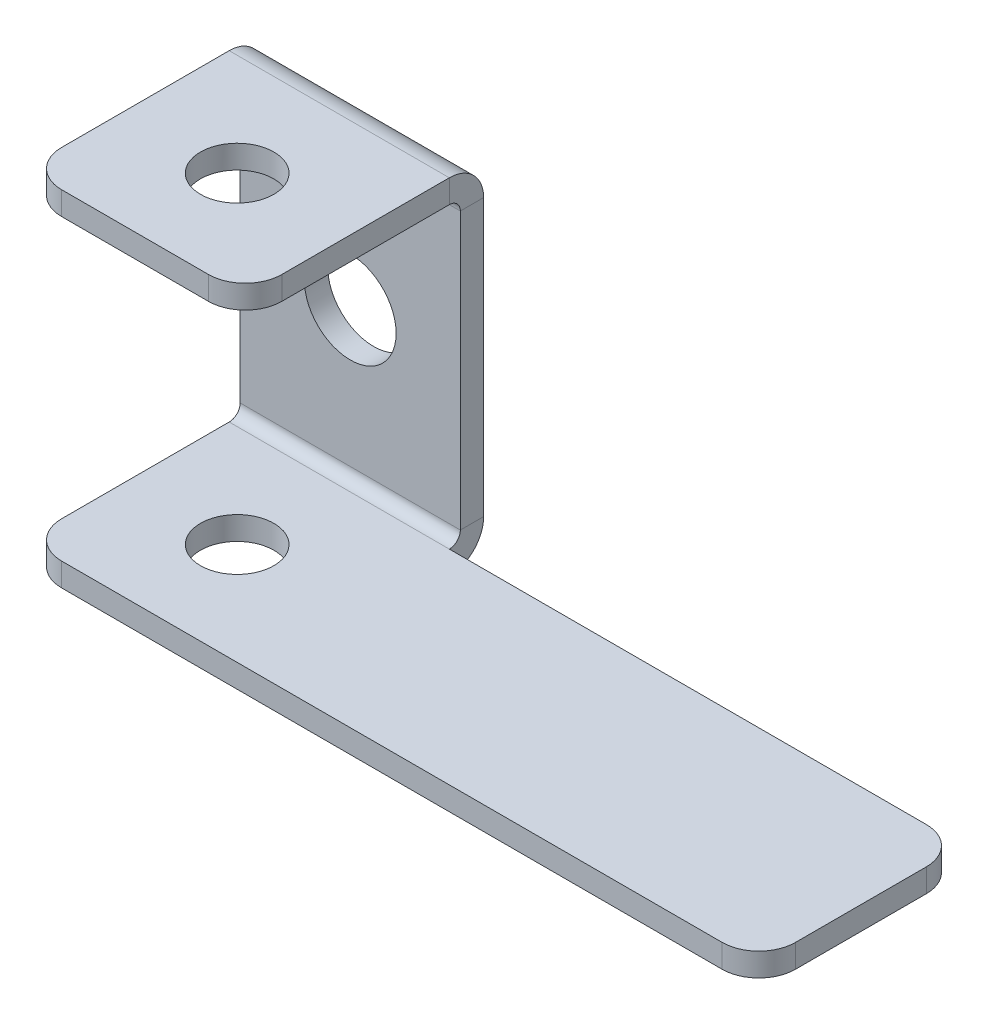
ISO-10303-21;
HEADER;
FILE_DESCRIPTION(('STEP AP214'),'2;1');
FILE_NAME('part.step','',(''),(''),'','','');
FILE_SCHEMA(('AUTOMOTIVE_DESIGN { 1 0 10303 214 1 1 1 1 }'));
ENDSEC;
DATA;
#1=APPLICATION_CONTEXT('core data for automotive mechanical design processes');
#2=APPLICATION_PROTOCOL_DEFINITION('international standard','automotive_design',2000,#1);
#3=PRODUCT_CONTEXT('',#1,'mechanical');
#4=PRODUCT('Part','Part','',(#3));
#5=PRODUCT_RELATED_PRODUCT_CATEGORY('part','',(#4));
#6=PRODUCT_DEFINITION_FORMATION('','',#4);
#7=PRODUCT_DEFINITION_CONTEXT('part definition',#1,'design');
#8=PRODUCT_DEFINITION('design','',#6,#7);
#9=PRODUCT_DEFINITION_SHAPE('','',#8);
#10=(LENGTH_UNIT() NAMED_UNIT(*) SI_UNIT(.MILLI.,.METRE.));
#11=(NAMED_UNIT(*) PLANE_ANGLE_UNIT() SI_UNIT($,.RADIAN.));
#12=(NAMED_UNIT(*) SI_UNIT($,.STERADIAN.) SOLID_ANGLE_UNIT());
#13=UNCERTAINTY_MEASURE_WITH_UNIT(LENGTH_MEASURE(1.E-05),#10,'distance_accuracy_value','');
#14=(GEOMETRIC_REPRESENTATION_CONTEXT(3) GLOBAL_UNCERTAINTY_ASSIGNED_CONTEXT((#13)) GLOBAL_UNIT_ASSIGNED_CONTEXT((#10,
#11,#12)) REPRESENTATION_CONTEXT('',''));
#15=CARTESIAN_POINT('',(0.,0.,0.));
#16=DIRECTION('',(0.,0.,1.));
#17=DIRECTION('',(1.,0.,0.));
#18=AXIS2_PLACEMENT_3D('',#15,#16,#17);
#19=CARTESIAN_POINT('',(0.,0.,-6.35));
#20=DIRECTION('',(0.,0.,1.));
#21=DIRECTION('',(1.,0.,0.));
#22=AXIS2_PLACEMENT_3D('',#19,#20,#21);
#23=PLANE('',#22);
#24=CARTESIAN_POINT('',(0.,0.,-6.35000000000002));
#25=DIRECTION('',(0.,0.,1.));
#26=DIRECTION('',(1.,0.,0.));
#27=AXIS2_PLACEMENT_3D('',#24,#25,#26);
#28=CIRCLE('',#27,12.5);
#29=CARTESIAN_POINT('',(12.5,0.,-6.35000000000002));
#30=VERTEX_POINT('',#29);
#31=EDGE_CURVE('E468',#30,#30,#28,.T.);
#32=ORIENTED_EDGE('',*,*,#31,.T.);
#33=EDGE_LOOP('',(#32));
#34=FACE_BOUND('',#33,.T.);
#35=DIRECTION('',(1.,0.,0.));
#36=VECTOR('',#35,1.);
#37=CARTESIAN_POINT('',(30.,-37.65,-6.35000000000002));
#38=LINE('',#37,#36);
#39=CARTESIAN_POINT('',(30.,-37.65,-6.35000000000002));
#40=VERTEX_POINT('',#39);
#41=CARTESIAN_POINT('',(-30.,-37.65,-6.35));
#42=VERTEX_POINT('',#41);
#43=EDGE_CURVE('E228',#40,#42,#38,.F.);
#44=ORIENTED_EDGE('',*,*,#43,.T.);
#45=DIRECTION('',(0.,-1.,0.));
#46=VECTOR('',#45,1.);
#47=CARTESIAN_POINT('',(-30.,-47.,-6.35));
#48=LINE('',#47,#46);
#49=CARTESIAN_POINT('',(-30.,37.65,-6.35000000000001));
#50=VERTEX_POINT('',#49);
#51=EDGE_CURVE('E313',#50,#42,#48,.T.);
#52=ORIENTED_EDGE('',*,*,#51,.F.);
#53=DIRECTION('',(-1.,0.,0.));
#54=VECTOR('',#53,1.);
#55=CARTESIAN_POINT('',(-30.,37.65,-6.35000000000001));
#56=LINE('',#55,#54);
#57=CARTESIAN_POINT('',(30.,37.65,-6.35));
#58=VERTEX_POINT('',#57);
#59=EDGE_CURVE('E289',#50,#58,#56,.F.);
#60=ORIENTED_EDGE('',*,*,#59,.T.);
#61=DIRECTION('',(0.,1.,0.));
#62=VECTOR('',#61,1.);
#63=CARTESIAN_POINT('',(30.,-47.,-6.35));
#64=LINE('',#63,#62);
#65=EDGE_CURVE('E316',#40,#58,#64,.T.);
#66=ORIENTED_EDGE('',*,*,#65,.F.);
#67=EDGE_LOOP('',(#44,#52,#60,#66));
#68=FACE_BOUND('',#67,.T.);
#69=ADVANCED_FACE('F77',(#34,#68),#23,.F.);
#70=CARTESIAN_POINT('',(0.,0.,0.));
#71=DIRECTION('',(0.,0.,1.));
#72=DIRECTION('',(1.,0.,0.));
#73=AXIS2_PLACEMENT_3D('',#70,#71,#72);
#74=PLANE('',#73);
#75=CARTESIAN_POINT('',(0.,0.,0.));
#76=DIRECTION('',(0.,0.,1.));
#77=DIRECTION('',(1.,0.,0.));
#78=AXIS2_PLACEMENT_3D('',#75,#76,#77);
#79=CIRCLE('',#78,12.5);
#80=CARTESIAN_POINT('',(12.5,0.,0.));
#81=VERTEX_POINT('',#80);
#82=EDGE_CURVE('E465',#81,#81,#79,.T.);
#83=ORIENTED_EDGE('',*,*,#82,.F.);
#84=EDGE_LOOP('',(#83));
#85=FACE_BOUND('',#84,.T.);
#86=DIRECTION('',(0.,-1.,0.));
#87=VECTOR('',#86,1.);
#88=CARTESIAN_POINT('',(-30.,-47.,0.));
#89=LINE('',#88,#87);
#90=CARTESIAN_POINT('',(-30.,37.65,0.));
#91=VERTEX_POINT('',#90);
#92=CARTESIAN_POINT('',(-30.,-37.65,0.));
#93=VERTEX_POINT('',#92);
#94=EDGE_CURVE('E310',#91,#93,#89,.T.);
#95=ORIENTED_EDGE('',*,*,#94,.T.);
#96=DIRECTION('',(1.,0.,0.));
#97=VECTOR('',#96,1.);
#98=CARTESIAN_POINT('',(30.,-37.65,0.));
#99=LINE('',#98,#97);
#100=CARTESIAN_POINT('',(30.,-37.65,0.));
#101=VERTEX_POINT('',#100);
#102=EDGE_CURVE('E255',#101,#93,#99,.F.);
#103=ORIENTED_EDGE('',*,*,#102,.F.);
#104=DIRECTION('',(0.,1.,0.));
#105=VECTOR('',#104,1.);
#106=CARTESIAN_POINT('',(30.,-47.,0.));
#107=LINE('',#106,#105);
#108=CARTESIAN_POINT('',(30.,37.65,0.));
#109=VERTEX_POINT('',#108);
#110=EDGE_CURVE('E317',#101,#109,#107,.T.);
#111=ORIENTED_EDGE('',*,*,#110,.T.);
#112=DIRECTION('',(-1.,0.,0.));
#113=VECTOR('',#112,1.);
#114=CARTESIAN_POINT('',(-30.,37.65,0.));
#115=LINE('',#114,#113);
#116=EDGE_CURVE('E302',#91,#109,#115,.F.);
#117=ORIENTED_EDGE('',*,*,#116,.F.);
#118=EDGE_LOOP('',(#95,#103,#111,#117));
#119=FACE_BOUND('',#118,.T.);
#120=ADVANCED_FACE('F382',(#85,#119),#74,.T.);
#121=CARTESIAN_POINT('',(30.,-47.,-6.35));
#122=DIRECTION('',(1.,0.,0.));
#123=DIRECTION('',(0.,0.,-1.));
#124=AXIS2_PLACEMENT_3D('',#121,#122,#123);
#125=PLANE('',#124);
#126=ORIENTED_EDGE('',*,*,#110,.F.);
#127=DIRECTION('',(0.,0.,-1.));
#128=VECTOR('',#127,1.);
#129=CARTESIAN_POINT('',(30.,-37.65,0.));
#130=LINE('',#129,#128);
#131=EDGE_CURVE('E251',#101,#40,#130,.T.);
#132=ORIENTED_EDGE('',*,*,#131,.T.);
#133=ORIENTED_EDGE('',*,*,#65,.T.);
#134=DIRECTION('',(0.,0.,-1.));
#135=VECTOR('',#134,1.);
#136=CARTESIAN_POINT('',(30.,37.65,0.));
#137=LINE('',#136,#135);
#138=EDGE_CURVE('E307',#109,#58,#137,.T.);
#139=ORIENTED_EDGE('',*,*,#138,.F.);
#140=EDGE_LOOP('',(#126,#132,#133,#139));
#141=FACE_BOUND('',#140,.T.);
#142=ADVANCED_FACE('F434',(#141),#125,.T.);
#143=CARTESIAN_POINT('',(-30.,-47.,-6.35));
#144=DIRECTION('',(-1.,0.,0.));
#145=DIRECTION('',(0.,0.,1.));
#146=AXIS2_PLACEMENT_3D('',#143,#144,#145);
#147=PLANE('',#146);
#148=DIRECTION('',(0.,0.,-1.));
#149=VECTOR('',#148,1.);
#150=CARTESIAN_POINT('',(-30.,-37.65,0.));
#151=LINE('',#150,#149);
#152=EDGE_CURVE('E260',#93,#42,#151,.T.);
#153=ORIENTED_EDGE('',*,*,#152,.F.);
#154=ORIENTED_EDGE('',*,*,#94,.F.);
#155=DIRECTION('',(0.,0.,-1.));
#156=VECTOR('',#155,1.);
#157=CARTESIAN_POINT('',(-30.,37.65,0.));
#158=LINE('',#157,#156);
#159=EDGE_CURVE('E296',#91,#50,#158,.T.);
#160=ORIENTED_EDGE('',*,*,#159,.T.);
#161=ORIENTED_EDGE('',*,*,#51,.T.);
#162=EDGE_LOOP('',(#153,#154,#160,#161));
#163=FACE_BOUND('',#162,.T.);
#164=ADVANCED_FACE('F379',(#163),#147,.T.);
#165=CARTESIAN_POINT('',(30.,37.65,3.));
#166=DIRECTION('',(1.,0.,0.));
#167=DIRECTION('',(0.,0.,-1.));
#168=AXIS2_PLACEMENT_3D('',#165,#166,#167);
#169=PLANE('',#168);
#170=DIRECTION('',(0.,-1.,0.));
#171=VECTOR('',#170,1.);
#172=CARTESIAN_POINT('',(30.,47.,2.99999999999997));
#173=LINE('',#172,#171);
#174=CARTESIAN_POINT('',(30.,40.65,2.99999999999999));
#175=VERTEX_POINT('',#174);
#176=CARTESIAN_POINT('',(30.,47.,2.99999999999997));
#177=VERTEX_POINT('',#176);
#178=EDGE_CURVE('E263',#175,#177,#173,.F.);
#179=ORIENTED_EDGE('',*,*,#178,.F.);
#180=CARTESIAN_POINT('',(30.,37.65,3.));
#181=DIRECTION('',(-1.,0.,0.));
#182=DIRECTION('',(0.,0.,1.));
#183=AXIS2_PLACEMENT_3D('',#180,#181,#182);
#184=CIRCLE('',#183,3.00000000000001);
#185=EDGE_CURVE('E299',#109,#175,#184,.F.);
#186=ORIENTED_EDGE('',*,*,#185,.F.);
#187=ORIENTED_EDGE('',*,*,#138,.T.);
#188=CARTESIAN_POINT('',(30.,37.65,3.));
#189=DIRECTION('',(-1.,0.,0.));
#190=DIRECTION('',(0.,0.,1.));
#191=AXIS2_PLACEMENT_3D('',#188,#189,#190);
#192=CIRCLE('',#191,9.35000000000001);
#193=EDGE_CURVE('E292',#58,#177,#192,.F.);
#194=ORIENTED_EDGE('',*,*,#193,.T.);
#195=EDGE_LOOP('',(#179,#186,#187,#194));
#196=FACE_BOUND('',#195,.T.);
#197=ADVANCED_FACE('F392',(#196),#169,.T.);
#198=CARTESIAN_POINT('',(-30.,37.65,3.));
#199=DIRECTION('',(1.,0.,0.));
#200=DIRECTION('',(0.,0.,-1.));
#201=AXIS2_PLACEMENT_3D('',#198,#199,#200);
#202=PLANE('',#201);
#203=CARTESIAN_POINT('',(-30.,37.65,3.));
#204=DIRECTION('',(-1.,0.,0.));
#205=DIRECTION('',(0.,0.,1.));
#206=AXIS2_PLACEMENT_3D('',#203,#204,#205);
#207=CIRCLE('',#206,3.00000000000001);
#208=CARTESIAN_POINT('',(-30.,40.65,2.99999999999999));
#209=VERTEX_POINT('',#208);
#210=EDGE_CURVE('E268',#209,#91,#207,.T.);
#211=ORIENTED_EDGE('',*,*,#210,.F.);
#212=DIRECTION('',(0.,-1.,0.));
#213=VECTOR('',#212,1.);
#214=CARTESIAN_POINT('',(-30.,40.65,2.99999999999999));
#215=LINE('',#214,#213);
#216=CARTESIAN_POINT('',(-30.,47.,2.99999999999997));
#217=VERTEX_POINT('',#216);
#218=EDGE_CURVE('E282',#209,#217,#215,.F.);
#219=ORIENTED_EDGE('',*,*,#218,.T.);
#220=CARTESIAN_POINT('',(-30.,37.65,3.));
#221=DIRECTION('',(-1.,0.,0.));
#222=DIRECTION('',(0.,0.,1.));
#223=AXIS2_PLACEMENT_3D('',#220,#221,#222);
#224=CIRCLE('',#223,9.35000000000001);
#225=EDGE_CURVE('E293',#217,#50,#224,.T.);
#226=ORIENTED_EDGE('',*,*,#225,.T.);
#227=ORIENTED_EDGE('',*,*,#159,.F.);
#228=EDGE_LOOP('',(#211,#219,#226,#227));
#229=FACE_BOUND('',#228,.T.);
#230=ADVANCED_FACE('F405',(#229),#202,.F.);
#231=CARTESIAN_POINT('',(-30.,37.65,3.));
#232=DIRECTION('',(-1.,0.,0.));
#233=DIRECTION('',(0.,1.,0.));
#234=AXIS2_PLACEMENT_3D('',#231,#232,#233);
#235=CYLINDRICAL_SURFACE('',#234,9.35000000000001);
#236=ORIENTED_EDGE('',*,*,#59,.F.);
#237=ORIENTED_EDGE('',*,*,#225,.F.);
#238=DIRECTION('',(-1.,0.,0.));
#239=VECTOR('',#238,1.);
#240=CARTESIAN_POINT('',(30.,47.,2.99999999999997));
#241=LINE('',#240,#239);
#242=EDGE_CURVE('E279',#217,#177,#241,.F.);
#243=ORIENTED_EDGE('',*,*,#242,.T.);
#244=ORIENTED_EDGE('',*,*,#193,.F.);
#245=EDGE_LOOP('',(#236,#237,#243,#244));
#246=FACE_BOUND('',#245,.T.);
#247=ADVANCED_FACE('F508',(#246),#235,.T.);
#248=CARTESIAN_POINT('',(-30.,37.65,3.));
#249=DIRECTION('',(-1.,0.,0.));
#250=DIRECTION('',(0.,1.,0.));
#251=AXIS2_PLACEMENT_3D('',#248,#249,#250);
#252=CYLINDRICAL_SURFACE('',#251,3.00000000000001);
#253=ORIENTED_EDGE('',*,*,#116,.T.);
#254=ORIENTED_EDGE('',*,*,#185,.T.);
#255=DIRECTION('',(-1.,0.,0.));
#256=VECTOR('',#255,1.);
#257=CARTESIAN_POINT('',(30.,40.65,2.99999999999999));
#258=LINE('',#257,#256);
#259=EDGE_CURVE('E285',#175,#209,#258,.T.);
#260=ORIENTED_EDGE('',*,*,#259,.T.);
#261=ORIENTED_EDGE('',*,*,#210,.T.);
#262=EDGE_LOOP('',(#253,#254,#260,#261));
#263=FACE_BOUND('',#262,.T.);
#264=ADVANCED_FACE('F387',(#263),#252,.F.);
#265=CARTESIAN_POINT('',(-30.,47.0000000000002,58.65));
#266=DIRECTION('',(1.,0.,0.));
#267=DIRECTION('',(0.,0.,-1.));
#268=AXIS2_PLACEMENT_3D('',#265,#266,#267);
#269=PLANE('',#268);
#270=DIRECTION('',(0.,0.,-1.));
#271=VECTOR('',#270,1.);
#272=CARTESIAN_POINT('',(-30.,40.6500000000002,58.65));
#273=LINE('',#272,#271);
#274=CARTESIAN_POINT('',(-30.,40.6500000000002,48.65));
#275=VERTEX_POINT('',#274);
#276=EDGE_CURVE('E277',#209,#275,#273,.F.);
#277=ORIENTED_EDGE('',*,*,#276,.T.);
#278=DIRECTION('',(0.,-1.,0.));
#279=VECTOR('',#278,1.);
#280=CARTESIAN_POINT('',(-30.,47.0000000000002,48.65));
#281=LINE('',#280,#279);
#282=CARTESIAN_POINT('',(-30.,47.0000000000002,48.65));
#283=VERTEX_POINT('',#282);
#284=EDGE_CURVE('E13',#275,#283,#281,.F.);
#285=ORIENTED_EDGE('',*,*,#284,.T.);
#286=DIRECTION('',(0.,0.,1.));
#287=VECTOR('',#286,1.);
#288=CARTESIAN_POINT('',(-30.,47.,-1.74791079324166E-13));
#289=LINE('',#288,#287);
#290=EDGE_CURVE('E271',#217,#283,#289,.T.);
#291=ORIENTED_EDGE('',*,*,#290,.F.);
#292=ORIENTED_EDGE('',*,*,#218,.F.);
#293=EDGE_LOOP('',(#277,#285,#291,#292));
#294=FACE_BOUND('',#293,.T.);
#295=ADVANCED_FACE('F407',(#294),#269,.F.);
#296=CARTESIAN_POINT('',(30.,47.,0.));
#297=DIRECTION('',(-1.,0.,0.));
#298=DIRECTION('',(0.,0.,1.));
#299=AXIS2_PLACEMENT_3D('',#296,#297,#298);
#300=PLANE('',#299);
#301=DIRECTION('',(0.,0.,-1.));
#302=VECTOR('',#301,1.);
#303=CARTESIAN_POINT('',(30.,47.,-1.99636223737133E-13));
#304=LINE('',#303,#302);
#305=CARTESIAN_POINT('',(30.,47.0000000000002,48.65));
#306=VERTEX_POINT('',#305);
#307=EDGE_CURVE('E266',#306,#177,#304,.T.);
#308=ORIENTED_EDGE('',*,*,#307,.F.);
#309=DIRECTION('',(0.,-1.,0.));
#310=VECTOR('',#309,1.);
#311=CARTESIAN_POINT('',(30.,47.0000000000002,48.65));
#312=LINE('',#311,#310);
#313=CARTESIAN_POINT('',(30.,40.6500000000002,48.65));
#314=VERTEX_POINT('',#313);
#315=EDGE_CURVE('E345',#306,#314,#312,.T.);
#316=ORIENTED_EDGE('',*,*,#315,.T.);
#317=DIRECTION('',(0.,0.,1.));
#318=VECTOR('',#317,1.);
#319=CARTESIAN_POINT('',(30.,40.65,0.));
#320=LINE('',#319,#318);
#321=EDGE_CURVE('E273',#314,#175,#320,.F.);
#322=ORIENTED_EDGE('',*,*,#321,.T.);
#323=ORIENTED_EDGE('',*,*,#178,.T.);
#324=EDGE_LOOP('',(#308,#316,#322,#323));
#325=FACE_BOUND('',#324,.T.);
#326=ADVANCED_FACE('F396',(#325),#300,.F.);
#327=CARTESIAN_POINT('',(0.,47.,-1.88988304703004E-13));
#328=DIRECTION('',(0.,-1.,0.));
#329=DIRECTION('',(0.,0.,-1.));
#330=AXIS2_PLACEMENT_3D('',#327,#328,#329);
#331=PLANE('',#330);
#332=CARTESIAN_POINT('',(0.,47.0000000000001,30.825));
#333=DIRECTION('',(0.,1.,0.));
#334=DIRECTION('',(0.,0.,1.));
#335=AXIS2_PLACEMENT_3D('',#332,#333,#334);
#336=CIRCLE('',#335,10.);
#337=CARTESIAN_POINT('',(0.,47.0000000000001,40.825));
#338=VERTEX_POINT('',#337);
#339=EDGE_CURVE('E776',#338,#338,#336,.T.);
#340=ORIENTED_EDGE('',*,*,#339,.F.);
#341=EDGE_LOOP('',(#340));
#342=FACE_BOUND('',#341,.T.);
#343=DIRECTION('',(1.,0.,0.));
#344=VECTOR('',#343,1.);
#345=CARTESIAN_POINT('',(0.,47.0000000000002,58.65));
#346=LINE('',#345,#344);
#347=CARTESIAN_POINT('',(-20.,47.0000000000002,58.65));
#348=VERTEX_POINT('',#347);
#349=CARTESIAN_POINT('',(20.,47.0000000000002,58.65));
#350=VERTEX_POINT('',#349);
#351=EDGE_CURVE('E269',#348,#350,#346,.T.);
#352=ORIENTED_EDGE('',*,*,#351,.T.);
#353=CARTESIAN_POINT('',(20.,47.0000000000002,48.65));
#354=DIRECTION('',(0.,-1.,0.));
#355=DIRECTION('',(0.,0.,-1.));
#356=AXIS2_PLACEMENT_3D('',#353,#354,#355);
#357=CIRCLE('',#356,10.);
#358=EDGE_CURVE('E358',#350,#306,#357,.F.);
#359=ORIENTED_EDGE('',*,*,#358,.T.);
#360=ORIENTED_EDGE('',*,*,#307,.T.);
#361=ORIENTED_EDGE('',*,*,#242,.F.);
#362=ORIENTED_EDGE('',*,*,#290,.T.);
#363=CARTESIAN_POINT('',(-20.,47.0000000000002,48.65));
#364=DIRECTION('',(0.,-1.,0.));
#365=DIRECTION('',(0.,0.,-1.));
#366=AXIS2_PLACEMENT_3D('',#363,#364,#365);
#367=CIRCLE('',#366,10.);
#368=EDGE_CURVE('E356',#283,#348,#367,.F.);
#369=ORIENTED_EDGE('',*,*,#368,.T.);
#370=EDGE_LOOP('',(#352,#359,#360,#361,#362,#369));
#371=FACE_BOUND('',#370,.T.);
#372=ADVANCED_FACE('F410',(#342,#371),#331,.F.);
#373=CARTESIAN_POINT('',(0.,40.65,-1.6681739820135E-13));
#374=DIRECTION('',(0.,-1.,0.));
#375=DIRECTION('',(0.,0.,-1.));
#376=AXIS2_PLACEMENT_3D('',#373,#374,#375);
#377=PLANE('',#376);
#378=CARTESIAN_POINT('',(0.,40.6500000000001,30.825));
#379=DIRECTION('',(0.,-1.,0.));
#380=DIRECTION('',(0.,0.,-1.));
#381=AXIS2_PLACEMENT_3D('',#378,#379,#380);
#382=CIRCLE('',#381,10.);
#383=CARTESIAN_POINT('',(0.,40.6500000000001,20.825));
#384=VERTEX_POINT('',#383);
#385=EDGE_CURVE('E769',#384,#384,#382,.T.);
#386=ORIENTED_EDGE('',*,*,#385,.F.);
#387=EDGE_LOOP('',(#386));
#388=FACE_BOUND('',#387,.T.);
#389=ORIENTED_EDGE('',*,*,#321,.F.);
#390=CARTESIAN_POINT('',(20.,40.6500000000002,48.65));
#391=DIRECTION('',(0.,-1.,0.));
#392=DIRECTION('',(0.,0.,-1.));
#393=AXIS2_PLACEMENT_3D('',#390,#391,#392);
#394=CIRCLE('',#393,10.);
#395=CARTESIAN_POINT('',(20.,40.6500000000002,58.65));
#396=VERTEX_POINT('',#395);
#397=EDGE_CURVE('E350',#314,#396,#394,.T.);
#398=ORIENTED_EDGE('',*,*,#397,.T.);
#399=DIRECTION('',(-1.,0.,0.));
#400=VECTOR('',#399,1.);
#401=CARTESIAN_POINT('',(30.,40.6500000000002,58.65));
#402=LINE('',#401,#400);
#403=CARTESIAN_POINT('',(-20.,40.6500000000002,58.65));
#404=VERTEX_POINT('',#403);
#405=EDGE_CURVE('E275',#404,#396,#402,.F.);
#406=ORIENTED_EDGE('',*,*,#405,.F.);
#407=CARTESIAN_POINT('',(-20.,40.6500000000002,48.65));
#408=DIRECTION('',(0.,-1.,0.));
#409=DIRECTION('',(0.,0.,-1.));
#410=AXIS2_PLACEMENT_3D('',#407,#408,#409);
#411=CIRCLE('',#410,10.);
#412=EDGE_CURVE('E348',#404,#275,#411,.T.);
#413=ORIENTED_EDGE('',*,*,#412,.T.);
#414=ORIENTED_EDGE('',*,*,#276,.F.);
#415=ORIENTED_EDGE('',*,*,#259,.F.);
#416=EDGE_LOOP('',(#389,#398,#406,#413,#414,#415));
#417=FACE_BOUND('',#416,.T.);
#418=ADVANCED_FACE('F400',(#388,#417),#377,.T.);
#419=CARTESIAN_POINT('',(30.,47.0000000000002,58.65));
#420=DIRECTION('',(0.,0.,-1.));
#421=DIRECTION('',(0.,1.,0.));
#422=AXIS2_PLACEMENT_3D('',#419,#420,#421);
#423=PLANE('',#422);
#424=ORIENTED_EDGE('',*,*,#405,.T.);
#425=DIRECTION('',(0.,-1.,0.));
#426=VECTOR('',#425,1.);
#427=CARTESIAN_POINT('',(20.,47.0000000000002,58.65));
#428=LINE('',#427,#426);
#429=EDGE_CURVE('E99',#396,#350,#428,.F.);
#430=ORIENTED_EDGE('',*,*,#429,.T.);
#431=ORIENTED_EDGE('',*,*,#351,.F.);
#432=DIRECTION('',(0.,-1.,0.));
#433=VECTOR('',#432,1.);
#434=CARTESIAN_POINT('',(-20.,47.0000000000002,58.65));
#435=LINE('',#434,#433);
#436=EDGE_CURVE('E352',#348,#404,#435,.T.);
#437=ORIENTED_EDGE('',*,*,#436,.T.);
#438=EDGE_LOOP('',(#424,#430,#431,#437));
#439=FACE_BOUND('',#438,.T.);
#440=ADVANCED_FACE('F413',(#439),#423,.F.);
#441=CARTESIAN_POINT('',(-30.,-37.65,3.));
#442=DIRECTION('',(-1.,0.,0.));
#443=DIRECTION('',(0.,0.,1.));
#444=AXIS2_PLACEMENT_3D('',#441,#442,#443);
#445=PLANE('',#444);
#446=DIRECTION('',(0.,0.,-1.));
#447=VECTOR('',#446,1.);
#448=CARTESIAN_POINT('',(-30.,-47.,-1.94312264220069E-13));
#449=LINE('',#448,#447);
#450=CARTESIAN_POINT('',(-30.,-47.0000000000002,48.65));
#451=VERTEX_POINT('',#450);
#452=CARTESIAN_POINT('',(-30.,-47.,2.99999999999997));
#453=VERTEX_POINT('',#452);
#454=EDGE_CURVE('E240',#451,#453,#449,.T.);
#455=ORIENTED_EDGE('',*,*,#454,.F.);
#456=DIRECTION('',(0.,1.,0.));
#457=VECTOR('',#456,1.);
#458=CARTESIAN_POINT('',(-30.,-40.6500000000002,48.65));
#459=LINE('',#458,#457);
#460=CARTESIAN_POINT('',(-30.,-40.6500000000002,48.65));
#461=VERTEX_POINT('',#460);
#462=EDGE_CURVE('E86',#451,#461,#459,.T.);
#463=ORIENTED_EDGE('',*,*,#462,.T.);
#464=DIRECTION('',(0.,0.,1.));
#465=VECTOR('',#464,1.);
#466=CARTESIAN_POINT('',(-30.,-40.65,0.));
#467=LINE('',#466,#465);
#468=CARTESIAN_POINT('',(-30.,-40.65,2.99999999999999));
#469=VERTEX_POINT('',#468);
#470=EDGE_CURVE('E241',#461,#469,#467,.F.);
#471=ORIENTED_EDGE('',*,*,#470,.T.);
#472=CARTESIAN_POINT('',(-30.,-37.65,3.));
#473=DIRECTION('',(1.,0.,0.));
#474=DIRECTION('',(0.,0.,-1.));
#475=AXIS2_PLACEMENT_3D('',#472,#473,#474);
#476=CIRCLE('',#475,3.00000000000001);
#477=EDGE_CURVE('E231',#93,#469,#476,.F.);
#478=ORIENTED_EDGE('',*,*,#477,.F.);
#479=ORIENTED_EDGE('',*,*,#152,.T.);
#480=CARTESIAN_POINT('',(-30.,-37.65,3.));
#481=DIRECTION('',(1.,0.,0.));
#482=DIRECTION('',(0.,0.,-1.));
#483=AXIS2_PLACEMENT_3D('',#480,#481,#482);
#484=CIRCLE('',#483,9.35000000000001);
#485=EDGE_CURVE('E250',#42,#453,#484,.F.);
#486=ORIENTED_EDGE('',*,*,#485,.T.);
#487=EDGE_LOOP('',(#455,#463,#471,#478,#479,#486));
#488=FACE_BOUND('',#487,.T.);
#489=ADVANCED_FACE('F364',(#488),#445,.T.);
#490=CARTESIAN_POINT('',(30.,-37.65,2.99999999999999));
#491=DIRECTION('',(-1.,0.,0.));
#492=DIRECTION('',(0.,0.,1.));
#493=AXIS2_PLACEMENT_3D('',#490,#491,#492);
#494=PLANE('',#493);
#495=CARTESIAN_POINT('',(30.,-37.65,2.99999999999999));
#496=DIRECTION('',(1.,0.,0.));
#497=DIRECTION('',(0.,0.,-1.));
#498=AXIS2_PLACEMENT_3D('',#495,#496,#497);
#499=CIRCLE('',#498,3.00000000000001);
#500=CARTESIAN_POINT('',(30.,-40.65,2.99999999999998));
#501=VERTEX_POINT('',#500);
#502=EDGE_CURVE('E236',#501,#101,#499,.T.);
#503=ORIENTED_EDGE('',*,*,#502,.F.);
#504=DIRECTION('',(0.,1.,0.));
#505=VECTOR('',#504,1.);
#506=CARTESIAN_POINT('',(30.,-40.65,2.99999999999998));
#507=LINE('',#506,#505);
#508=CARTESIAN_POINT('',(30.,-47.,2.99999999999996));
#509=VERTEX_POINT('',#508);
#510=EDGE_CURVE('E210',#501,#509,#507,.F.);
#511=ORIENTED_EDGE('',*,*,#510,.T.);
#512=CARTESIAN_POINT('',(30.,-37.65,2.99999999999999));
#513=DIRECTION('',(1.,0.,0.));
#514=DIRECTION('',(0.,0.,-1.));
#515=AXIS2_PLACEMENT_3D('',#512,#513,#514);
#516=CIRCLE('',#515,9.35000000000001);
#517=EDGE_CURVE('E223',#509,#40,#516,.T.);
#518=ORIENTED_EDGE('',*,*,#517,.T.);
#519=ORIENTED_EDGE('',*,*,#131,.F.);
#520=EDGE_LOOP('',(#503,#511,#518,#519));
#521=FACE_BOUND('',#520,.T.);
#522=ADVANCED_FACE('F234',(#521),#494,.F.);
#523=CARTESIAN_POINT('',(30.,-37.65,2.99999999999999));
#524=DIRECTION('',(1.,0.,0.));
#525=DIRECTION('',(0.,-1.,0.));
#526=AXIS2_PLACEMENT_3D('',#523,#524,#525);
#527=CYLINDRICAL_SURFACE('',#526,9.35000000000001);
#528=ORIENTED_EDGE('',*,*,#43,.F.);
#529=ORIENTED_EDGE('',*,*,#517,.F.);
#530=DIRECTION('',(1.,0.,0.));
#531=VECTOR('',#530,1.);
#532=CARTESIAN_POINT('',(-30.,-47.,2.99999999999997));
#533=LINE('',#532,#531);
#534=EDGE_CURVE('E226',#509,#453,#533,.F.);
#535=ORIENTED_EDGE('',*,*,#534,.T.);
#536=ORIENTED_EDGE('',*,*,#485,.F.);
#537=EDGE_LOOP('',(#528,#529,#535,#536));
#538=FACE_BOUND('',#537,.T.);
#539=ADVANCED_FACE('F224',(#538),#527,.T.);
#540=CARTESIAN_POINT('',(30.,-37.65,2.99999999999999));
#541=DIRECTION('',(1.,0.,0.));
#542=DIRECTION('',(0.,-1.,0.));
#543=AXIS2_PLACEMENT_3D('',#540,#541,#542);
#544=CYLINDRICAL_SURFACE('',#543,3.00000000000001);
#545=ORIENTED_EDGE('',*,*,#102,.T.);
#546=ORIENTED_EDGE('',*,*,#477,.T.);
#547=DIRECTION('',(1.,0.,0.));
#548=VECTOR('',#547,1.);
#549=CARTESIAN_POINT('',(-30.,-40.65,2.99999999999999));
#550=LINE('',#549,#548);
#551=EDGE_CURVE('E216',#469,#501,#550,.T.);
#552=ORIENTED_EDGE('',*,*,#551,.T.);
#553=ORIENTED_EDGE('',*,*,#502,.T.);
#554=EDGE_LOOP('',(#545,#546,#552,#553));
#555=FACE_BOUND('',#554,.T.);
#556=ADVANCED_FACE('F376',(#555),#544,.F.);
#557=CARTESIAN_POINT('',(0.,-47.,-1.88988304703004E-13));
#558=DIRECTION('',(0.,1.,0.));
#559=DIRECTION('',(0.,0.,1.));
#560=AXIS2_PLACEMENT_3D('',#557,#558,#559);
#561=PLANE('',#560);
#562=CARTESIAN_POINT('',(0.,-47.0000000000004,30.8250000000003));
#563=DIRECTION('',(0.,1.,0.));
#564=DIRECTION('',(0.,0.,1.));
#565=AXIS2_PLACEMENT_3D('',#562,#563,#564);
#566=CIRCLE('',#565,10.);
#567=CARTESIAN_POINT('',(0.,-47.0000000000003,40.8250000000003));
#568=VERTEX_POINT('',#567);
#569=EDGE_CURVE('E774',#568,#568,#566,.T.);
#570=ORIENTED_EDGE('',*,*,#569,.T.);
#571=EDGE_LOOP('',(#570));
#572=FACE_BOUND('',#571,.T.);
#573=DIRECTION('',(-1.,0.,0.));
#574=VECTOR('',#573,1.);
#575=CARTESIAN_POINT('',(-30.,-47.,2.99999999999997));
#576=LINE('',#575,#574);
#577=CARTESIAN_POINT('',(160.,-47.,2.99999999999997));
#578=VERTEX_POINT('',#577);
#579=EDGE_CURVE('E205',#578,#509,#576,.T.);
#580=ORIENTED_EDGE('',*,*,#579,.F.);
#581=CARTESIAN_POINT('',(160.,-47.,13.));
#582=DIRECTION('',(0.,1.,0.));
#583=DIRECTION('',(0.,0.,1.));
#584=AXIS2_PLACEMENT_3D('',#581,#582,#583);
#585=CIRCLE('',#584,10.);
#586=CARTESIAN_POINT('',(170.,-47.,13.));
#587=VERTEX_POINT('',#586);
#588=EDGE_CURVE('E338',#578,#587,#585,.F.);
#589=ORIENTED_EDGE('',*,*,#588,.T.);
#590=DIRECTION('',(0.,0.,-1.));
#591=VECTOR('',#590,1.);
#592=CARTESIAN_POINT('',(170.,-47.,2.99999999999997));
#593=LINE('',#592,#591);
#594=CARTESIAN_POINT('',(170.,-47.0000000000002,48.65));
#595=VERTEX_POINT('',#594);
#596=EDGE_CURVE('E217',#595,#587,#593,.T.);
#597=ORIENTED_EDGE('',*,*,#596,.F.);
#598=CARTESIAN_POINT('',(160.,-47.0000000000001,48.65));
#599=DIRECTION('',(0.,1.,0.));
#600=DIRECTION('',(0.,0.,1.));
#601=AXIS2_PLACEMENT_3D('',#598,#599,#600);
#602=CIRCLE('',#601,10.);
#603=CARTESIAN_POINT('',(160.,-47.0000000000002,58.65));
#604=VERTEX_POINT('',#603);
#605=EDGE_CURVE('E336',#595,#604,#602,.F.);
#606=ORIENTED_EDGE('',*,*,#605,.T.);
#607=DIRECTION('',(-1.,0.,0.));
#608=VECTOR('',#607,1.);
#609=CARTESIAN_POINT('',(0.,-47.0000000000002,58.65));
#610=LINE('',#609,#608);
#611=CARTESIAN_POINT('',(-20.,-47.0000000000002,58.65));
#612=VERTEX_POINT('',#611);
#613=EDGE_CURVE('E259',#604,#612,#610,.T.);
#614=ORIENTED_EDGE('',*,*,#613,.T.);
#615=CARTESIAN_POINT('',(-20.,-47.0000000000002,48.65));
#616=DIRECTION('',(0.,1.,0.));
#617=DIRECTION('',(0.,0.,1.));
#618=AXIS2_PLACEMENT_3D('',#615,#616,#617);
#619=CIRCLE('',#618,10.);
#620=EDGE_CURVE('E334',#612,#451,#619,.F.);
#621=ORIENTED_EDGE('',*,*,#620,.T.);
#622=ORIENTED_EDGE('',*,*,#454,.T.);
#623=ORIENTED_EDGE('',*,*,#534,.F.);
#624=EDGE_LOOP('',(#580,#589,#597,#606,#614,#621,#622,#623));
#625=FACE_BOUND('',#624,.T.);
#626=ADVANCED_FACE('F238',(#572,#625),#561,.F.);
#627=CARTESIAN_POINT('',(0.,-40.65,-1.6681739820135E-13));
#628=DIRECTION('',(0.,1.,0.));
#629=DIRECTION('',(0.,0.,1.));
#630=AXIS2_PLACEMENT_3D('',#627,#628,#629);
#631=PLANE('',#630);
#632=CARTESIAN_POINT('',(0.,-40.6500000000001,30.8250000000003));
#633=DIRECTION('',(0.,1.,0.));
#634=DIRECTION('',(0.,0.,1.));
#635=AXIS2_PLACEMENT_3D('',#632,#633,#634);
#636=CIRCLE('',#635,10.);
#637=CARTESIAN_POINT('',(0.,-40.6500000000001,40.8250000000003));
#638=VERTEX_POINT('',#637);
#639=EDGE_CURVE('E81',#638,#638,#636,.T.);
#640=ORIENTED_EDGE('',*,*,#639,.F.);
#641=EDGE_LOOP('',(#640));
#642=FACE_BOUND('',#641,.T.);
#643=DIRECTION('',(0.,0.,-1.));
#644=VECTOR('',#643,1.);
#645=CARTESIAN_POINT('',(170.,-40.65,2.99999999999999));
#646=LINE('',#645,#644);
#647=CARTESIAN_POINT('',(170.,-40.6500000000002,48.65));
#648=VERTEX_POINT('',#647);
#649=CARTESIAN_POINT('',(170.,-40.65,13.));
#650=VERTEX_POINT('',#649);
#651=EDGE_CURVE('E462',#648,#650,#646,.T.);
#652=ORIENTED_EDGE('',*,*,#651,.T.);
#653=CARTESIAN_POINT('',(160.,-40.65,13.));
#654=DIRECTION('',(0.,1.,0.));
#655=DIRECTION('',(0.,0.,1.));
#656=AXIS2_PLACEMENT_3D('',#653,#654,#655);
#657=CIRCLE('',#656,10.);
#658=CARTESIAN_POINT('',(160.,-40.65,2.99999999999999));
#659=VERTEX_POINT('',#658);
#660=EDGE_CURVE('E331',#650,#659,#657,.T.);
#661=ORIENTED_EDGE('',*,*,#660,.T.);
#662=DIRECTION('',(-1.,0.,0.));
#663=VECTOR('',#662,1.);
#664=CARTESIAN_POINT('',(-30.,-40.65,2.99999999999999));
#665=LINE('',#664,#663);
#666=EDGE_CURVE('E374',#659,#501,#665,.T.);
#667=ORIENTED_EDGE('',*,*,#666,.T.);
#668=ORIENTED_EDGE('',*,*,#551,.F.);
#669=ORIENTED_EDGE('',*,*,#470,.F.);
#670=CARTESIAN_POINT('',(-20.,-40.6500000000002,48.65));
#671=DIRECTION('',(0.,1.,0.));
#672=DIRECTION('',(0.,0.,1.));
#673=AXIS2_PLACEMENT_3D('',#670,#671,#672);
#674=CIRCLE('',#673,10.);
#675=CARTESIAN_POINT('',(-20.,-40.6500000000002,58.65));
#676=VERTEX_POINT('',#675);
#677=EDGE_CURVE('E327',#461,#676,#674,.T.);
#678=ORIENTED_EDGE('',*,*,#677,.T.);
#679=DIRECTION('',(1.,0.,0.));
#680=VECTOR('',#679,1.);
#681=CARTESIAN_POINT('',(-30.,-40.6500000000002,58.65));
#682=LINE('',#681,#680);
#683=CARTESIAN_POINT('',(160.,-40.6500000000002,58.65));
#684=VERTEX_POINT('',#683);
#685=EDGE_CURVE('E243',#684,#676,#682,.F.);
#686=ORIENTED_EDGE('',*,*,#685,.F.);
#687=CARTESIAN_POINT('',(160.,-40.6500000000001,48.65));
#688=DIRECTION('',(0.,1.,0.));
#689=DIRECTION('',(0.,0.,1.));
#690=AXIS2_PLACEMENT_3D('',#687,#688,#689);
#691=CIRCLE('',#690,10.);
#692=EDGE_CURVE('E329',#684,#648,#691,.T.);
#693=ORIENTED_EDGE('',*,*,#692,.T.);
#694=EDGE_LOOP('',(#652,#661,#667,#668,#669,#678,#686,#693));
#695=FACE_BOUND('',#694,.T.);
#696=ADVANCED_FACE('F371',(#642,#695),#631,.T.);
#697=CARTESIAN_POINT('',(-30.,-47.0000000000002,58.65));
#698=DIRECTION('',(0.,0.,-1.));
#699=DIRECTION('',(0.,1.,0.));
#700=AXIS2_PLACEMENT_3D('',#697,#698,#699);
#701=PLANE('',#700);
#702=ORIENTED_EDGE('',*,*,#613,.F.);
#703=DIRECTION('',(0.,1.,0.));
#704=VECTOR('',#703,1.);
#705=CARTESIAN_POINT('',(160.,-40.6500000000002,58.65));
#706=LINE('',#705,#704);
#707=EDGE_CURVE('E342',#604,#684,#706,.T.);
#708=ORIENTED_EDGE('',*,*,#707,.T.);
#709=ORIENTED_EDGE('',*,*,#685,.T.);
#710=DIRECTION('',(0.,1.,0.));
#711=VECTOR('',#710,1.);
#712=CARTESIAN_POINT('',(-20.,-47.0000000000002,58.65));
#713=LINE('',#712,#711);
#714=EDGE_CURVE('E340',#676,#612,#713,.F.);
#715=ORIENTED_EDGE('',*,*,#714,.T.);
#716=EDGE_LOOP('',(#702,#708,#709,#715));
#717=FACE_BOUND('',#716,.T.);
#718=ADVANCED_FACE('F475',(#717),#701,.F.);
#719=CARTESIAN_POINT('',(-30.,-47.,2.99999999999997));
#720=DIRECTION('',(0.,0.,-1.));
#721=DIRECTION('',(0.,1.,0.));
#722=AXIS2_PLACEMENT_3D('',#719,#720,#721);
#723=PLANE('',#722);
#724=ORIENTED_EDGE('',*,*,#666,.F.);
#725=DIRECTION('',(0.,1.,0.));
#726=VECTOR('',#725,1.);
#727=CARTESIAN_POINT('',(160.,-47.,2.99999999999997));
#728=LINE('',#727,#726);
#729=EDGE_CURVE('E212',#659,#578,#728,.F.);
#730=ORIENTED_EDGE('',*,*,#729,.T.);
#731=ORIENTED_EDGE('',*,*,#579,.T.);
#732=ORIENTED_EDGE('',*,*,#510,.F.);
#733=EDGE_LOOP('',(#724,#730,#731,#732));
#734=FACE_BOUND('',#733,.T.);
#735=ADVANCED_FACE('F208',(#734),#723,.T.);
#736=CARTESIAN_POINT('',(170.,-47.,2.99999999999997));
#737=DIRECTION('',(1.,0.,0.));
#738=DIRECTION('',(0.,0.,-1.));
#739=AXIS2_PLACEMENT_3D('',#736,#737,#738);
#740=PLANE('',#739);
#741=ORIENTED_EDGE('',*,*,#596,.T.);
#742=DIRECTION('',(0.,1.,0.));
#743=VECTOR('',#742,1.);
#744=CARTESIAN_POINT('',(170.,-47.,13.));
#745=LINE('',#744,#743);
#746=EDGE_CURVE('E324',#587,#650,#745,.T.);
#747=ORIENTED_EDGE('',*,*,#746,.T.);
#748=ORIENTED_EDGE('',*,*,#651,.F.);
#749=DIRECTION('',(0.,1.,0.));
#750=VECTOR('',#749,1.);
#751=CARTESIAN_POINT('',(170.,-47.0000000000002,48.65));
#752=LINE('',#751,#750);
#753=EDGE_CURVE('E319',#648,#595,#752,.F.);
#754=ORIENTED_EDGE('',*,*,#753,.T.);
#755=EDGE_LOOP('',(#741,#747,#748,#754));
#756=FACE_BOUND('',#755,.T.);
#757=ADVANCED_FACE('F448',(#756),#740,.T.);
#758=CARTESIAN_POINT('',(160.,-47.,13.));
#759=DIRECTION('',(0.,1.,0.));
#760=DIRECTION('',(0.,0.,1.));
#761=AXIS2_PLACEMENT_3D('',#758,#759,#760);
#762=CYLINDRICAL_SURFACE('',#761,10.);
#763=ORIENTED_EDGE('',*,*,#588,.F.);
#764=ORIENTED_EDGE('',*,*,#729,.F.);
#765=ORIENTED_EDGE('',*,*,#660,.F.);
#766=ORIENTED_EDGE('',*,*,#746,.F.);
#767=EDGE_LOOP('',(#763,#764,#765,#766));
#768=FACE_BOUND('',#767,.T.);
#769=ADVANCED_FACE('F425',(#768),#762,.T.);
#770=CARTESIAN_POINT('',(160.,-47.0000000000002,48.65));
#771=DIRECTION('',(0.,-1.,0.));
#772=DIRECTION('',(0.,0.,-1.));
#773=AXIS2_PLACEMENT_3D('',#770,#771,#772);
#774=CYLINDRICAL_SURFACE('',#773,10.);
#775=ORIENTED_EDGE('',*,*,#605,.F.);
#776=ORIENTED_EDGE('',*,*,#753,.F.);
#777=ORIENTED_EDGE('',*,*,#692,.F.);
#778=ORIENTED_EDGE('',*,*,#707,.F.);
#779=EDGE_LOOP('',(#775,#776,#777,#778));
#780=FACE_BOUND('',#779,.T.);
#781=ADVANCED_FACE('F419',(#780),#774,.T.);
#782=CARTESIAN_POINT('',(20.,47.0000000000002,48.65));
#783=DIRECTION('',(0.,-1.,0.));
#784=DIRECTION('',(0.,0.,-1.));
#785=AXIS2_PLACEMENT_3D('',#782,#783,#784);
#786=CYLINDRICAL_SURFACE('',#785,10.);
#787=ORIENTED_EDGE('',*,*,#358,.F.);
#788=ORIENTED_EDGE('',*,*,#429,.F.);
#789=ORIENTED_EDGE('',*,*,#397,.F.);
#790=ORIENTED_EDGE('',*,*,#315,.F.);
#791=EDGE_LOOP('',(#787,#788,#789,#790));
#792=FACE_BOUND('',#791,.T.);
#793=ADVANCED_FACE('F416',(#792),#786,.T.);
#794=CARTESIAN_POINT('',(-20.,-37.6500000000002,48.65));
#795=DIRECTION('',(0.,-1.,0.));
#796=DIRECTION('',(0.,0.,-1.));
#797=AXIS2_PLACEMENT_3D('',#794,#795,#796);
#798=CYLINDRICAL_SURFACE('',#797,10.);
#799=ORIENTED_EDGE('',*,*,#620,.F.);
#800=ORIENTED_EDGE('',*,*,#714,.F.);
#801=ORIENTED_EDGE('',*,*,#677,.F.);
#802=ORIENTED_EDGE('',*,*,#462,.F.);
#803=EDGE_LOOP('',(#799,#800,#801,#802));
#804=FACE_BOUND('',#803,.T.);
#805=ADVANCED_FACE('F418',(#804),#798,.T.);
#806=CARTESIAN_POINT('',(-20.,47.0000000000002,48.65));
#807=DIRECTION('',(0.,-1.,0.));
#808=DIRECTION('',(0.,0.,-1.));
#809=AXIS2_PLACEMENT_3D('',#806,#807,#808);
#810=CYLINDRICAL_SURFACE('',#809,10.);
#811=ORIENTED_EDGE('',*,*,#368,.F.);
#812=ORIENTED_EDGE('',*,*,#284,.F.);
#813=ORIENTED_EDGE('',*,*,#412,.F.);
#814=ORIENTED_EDGE('',*,*,#436,.F.);
#815=EDGE_LOOP('',(#811,#812,#813,#814));
#816=FACE_BOUND('',#815,.T.);
#817=ADVANCED_FACE('F79',(#816),#810,.T.);
#818=CARTESIAN_POINT('',(0.,0.,-6.35000000000002));
#819=DIRECTION('',(0.,0.,1.));
#820=DIRECTION('',(1.,0.,0.));
#821=AXIS2_PLACEMENT_3D('',#818,#819,#820);
#822=CYLINDRICAL_SURFACE('',#821,12.5);
#823=ORIENTED_EDGE('',*,*,#31,.F.);
#824=EDGE_LOOP('',(#823));
#825=FACE_BOUND('',#824,.T.);
#826=ORIENTED_EDGE('',*,*,#82,.T.);
#827=EDGE_LOOP('',(#826));
#828=FACE_BOUND('',#827,.T.);
#829=ADVANCED_FACE('F587',(#825,#828),#822,.F.);
#830=CARTESIAN_POINT('',(0.,-47.0000000000004,30.8250000000003));
#831=DIRECTION('',(0.,1.,0.));
#832=DIRECTION('',(0.,0.,1.));
#833=AXIS2_PLACEMENT_3D('',#830,#831,#832);
#834=CYLINDRICAL_SURFACE('',#833,10.);
#835=ORIENTED_EDGE('',*,*,#639,.T.);
#836=EDGE_LOOP('',(#835));
#837=FACE_BOUND('',#836,.T.);
#838=ORIENTED_EDGE('',*,*,#569,.F.);
#839=EDGE_LOOP('',(#838));
#840=FACE_BOUND('',#839,.T.);
#841=ADVANCED_FACE('F581',(#837,#840),#834,.F.);
#842=ORIENTED_EDGE('',*,*,#385,.T.);
#843=EDGE_LOOP('',(#842));
#844=FACE_BOUND('',#843,.T.);
#845=ORIENTED_EDGE('',*,*,#339,.T.);
#846=EDGE_LOOP('',(#845));
#847=FACE_BOUND('',#846,.T.);
#848=ADVANCED_FACE('F586',(#844,#847),#834,.F.);
#849=CLOSED_SHELL('',(#69,#120,#142,#164,#197,#230,#247,#264,#295,#326,#372,#418,#440,#489,#522,
#539,#556,#626,#696,#718,#735,#757,#769,#781,#793,#805,#817,#829,#841,#848));
#850=MANIFOLD_SOLID_BREP('B2',#849);
#851=ADVANCED_BREP_SHAPE_REPRESENTATION('',(#18,#850),#14);
#852=SHAPE_DEFINITION_REPRESENTATION(#9,#851);
ENDSEC;
END-ISO-10303-21;
